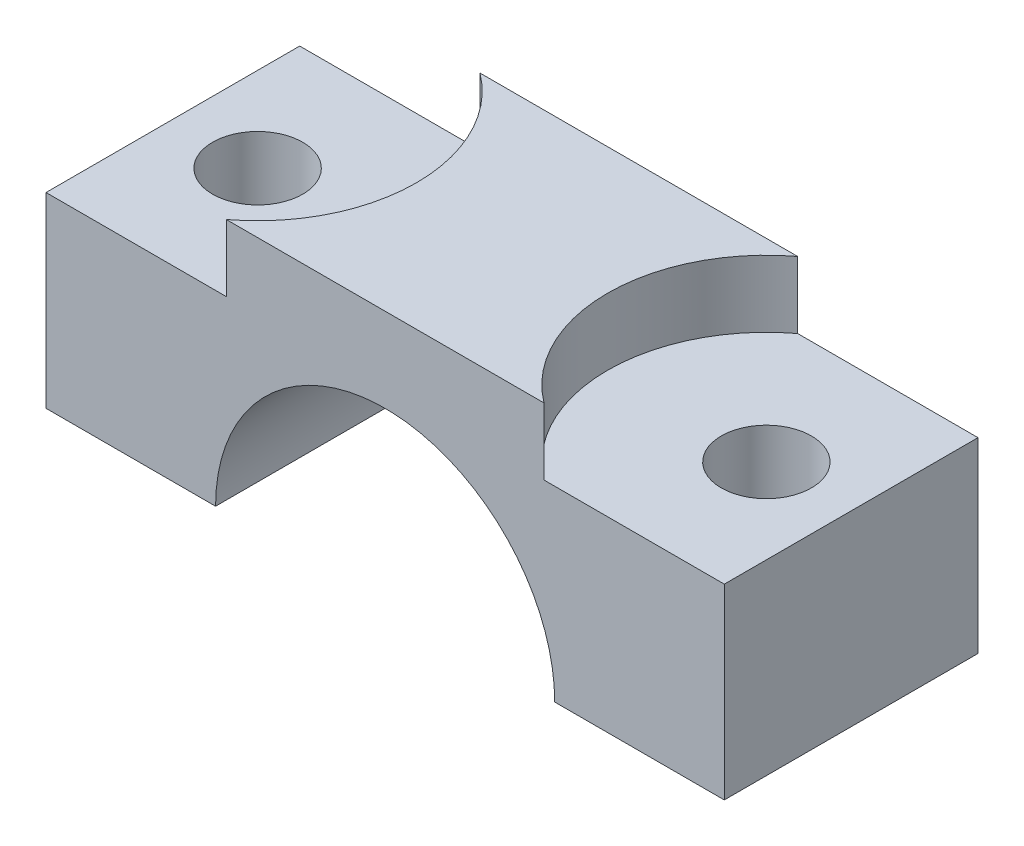
ISO-10303-21;
HEADER;
FILE_DESCRIPTION(('STEP AP214'),'2;1');
FILE_NAME('part.step','',(''),(''),'','','');
FILE_SCHEMA(('AUTOMOTIVE_DESIGN { 1 0 10303 214 1 1 1 1 }'));
ENDSEC;
DATA;
#1=APPLICATION_CONTEXT('core data for automotive mechanical design processes');
#2=APPLICATION_PROTOCOL_DEFINITION('international standard','automotive_design',2000,#1);
#3=PRODUCT_CONTEXT('',#1,'mechanical');
#4=PRODUCT('Part','Part','',(#3));
#5=PRODUCT_RELATED_PRODUCT_CATEGORY('part','',(#4));
#6=PRODUCT_DEFINITION_FORMATION('','',#4);
#7=PRODUCT_DEFINITION_CONTEXT('part definition',#1,'design');
#8=PRODUCT_DEFINITION('design','',#6,#7);
#9=PRODUCT_DEFINITION_SHAPE('','',#8);
#10=(LENGTH_UNIT() NAMED_UNIT(*) SI_UNIT(.MILLI.,.METRE.));
#11=(NAMED_UNIT(*) PLANE_ANGLE_UNIT() SI_UNIT($,.RADIAN.));
#12=(NAMED_UNIT(*) SI_UNIT($,.STERADIAN.) SOLID_ANGLE_UNIT());
#13=UNCERTAINTY_MEASURE_WITH_UNIT(LENGTH_MEASURE(1.E-05),#10,'distance_accuracy_value','');
#14=(GEOMETRIC_REPRESENTATION_CONTEXT(3) GLOBAL_UNCERTAINTY_ASSIGNED_CONTEXT((#13)) GLOBAL_UNIT_ASSIGNED_CONTEXT((#10,
#11,#12)) REPRESENTATION_CONTEXT('',''));
#15=CARTESIAN_POINT('',(0.,0.,0.));
#16=DIRECTION('',(0.,0.,1.));
#17=DIRECTION('',(1.,0.,0.));
#18=AXIS2_PLACEMENT_3D('',#15,#16,#17);
#19=CARTESIAN_POINT('',(25.4,0.,19.));
#20=DIRECTION('',(-1.,0.,0.));
#21=DIRECTION('',(0.,0.,1.));
#22=AXIS2_PLACEMENT_3D('',#19,#20,#21);
#23=PLANE('',#22);
#24=DIRECTION('',(0.,1.,0.));
#25=VECTOR('',#24,1.);
#26=CARTESIAN_POINT('',(25.4,0.,0.));
#27=LINE('',#26,#25);
#28=CARTESIAN_POINT('',(25.4,0.,0.));
#29=VERTEX_POINT('',#28);
#30=CARTESIAN_POINT('',(25.4,14.,0.));
#31=VERTEX_POINT('',#30);
#32=EDGE_CURVE('E142',#29,#31,#27,.T.);
#33=ORIENTED_EDGE('',*,*,#32,.T.);
#34=DIRECTION('',(0.,0.,1.));
#35=VECTOR('',#34,1.);
#36=CARTESIAN_POINT('',(25.4,14.,19.));
#37=LINE('',#36,#35);
#38=CARTESIAN_POINT('',(25.4,14.,19.));
#39=VERTEX_POINT('',#38);
#40=EDGE_CURVE('E124',#31,#39,#37,.T.);
#41=ORIENTED_EDGE('',*,*,#40,.T.);
#42=DIRECTION('',(0.,1.,0.));
#43=VECTOR('',#42,1.);
#44=CARTESIAN_POINT('',(25.4,0.,19.));
#45=LINE('',#44,#43);
#46=CARTESIAN_POINT('',(25.4,0.,19.));
#47=VERTEX_POINT('',#46);
#48=EDGE_CURVE('E161',#47,#39,#45,.T.);
#49=ORIENTED_EDGE('',*,*,#48,.F.);
#50=DIRECTION('',(0.,0.,-1.));
#51=VECTOR('',#50,1.);
#52=CARTESIAN_POINT('',(25.4,0.,19.));
#53=LINE('',#52,#51);
#54=EDGE_CURVE('E162',#47,#29,#53,.T.);
#55=ORIENTED_EDGE('',*,*,#54,.T.);
#56=EDGE_LOOP('',(#33,#41,#49,#55));
#57=FACE_BOUND('',#56,.T.);
#58=ADVANCED_FACE('F39',(#57),#23,.F.);
#59=CARTESIAN_POINT('',(25.4,19.,19.));
#60=DIRECTION('',(0.,-1.,0.));
#61=DIRECTION('',(0.,0.,-1.));
#62=AXIS2_PLACEMENT_3D('',#59,#60,#61);
#63=PLANE('',#62);
#64=DIRECTION('',(-1.,0.,0.));
#65=VECTOR('',#64,1.);
#66=CARTESIAN_POINT('',(25.4,19.,19.));
#67=LINE('',#66,#65);
#68=CARTESIAN_POINT('',(11.8958713842984,19.,19.));
#69=VERTEX_POINT('',#68);
#70=CARTESIAN_POINT('',(-11.8958713842984,19.,19.));
#71=VERTEX_POINT('',#70);
#72=EDGE_CURVE('E133',#69,#71,#67,.T.);
#73=ORIENTED_EDGE('',*,*,#72,.F.);
#74=CARTESIAN_POINT('',(19.05,19.,9.5));
#75=DIRECTION('',(0.,1.,0.));
#76=DIRECTION('',(0.,0.,1.));
#77=AXIS2_PLACEMENT_3D('',#74,#75,#76);
#78=CIRCLE('',#77,11.8925);
#79=CARTESIAN_POINT('',(11.8958713842984,19.,0.));
#80=VERTEX_POINT('',#79);
#81=EDGE_CURVE('E55',#80,#69,#78,.T.);
#82=ORIENTED_EDGE('',*,*,#81,.F.);
#83=DIRECTION('',(-1.,0.,0.));
#84=VECTOR('',#83,1.);
#85=CARTESIAN_POINT('',(25.4,19.,0.));
#86=LINE('',#85,#84);
#87=CARTESIAN_POINT('',(-11.8958713842984,19.,0.));
#88=VERTEX_POINT('',#87);
#89=EDGE_CURVE('E131',#80,#88,#86,.T.);
#90=ORIENTED_EDGE('',*,*,#89,.T.);
#91=CARTESIAN_POINT('',(-19.05,19.,9.5));
#92=DIRECTION('',(0.,1.,0.));
#93=DIRECTION('',(0.,0.,1.));
#94=AXIS2_PLACEMENT_3D('',#91,#92,#93);
#95=CIRCLE('',#94,11.8925);
#96=EDGE_CURVE('E239',#71,#88,#95,.T.);
#97=ORIENTED_EDGE('',*,*,#96,.F.);
#98=EDGE_LOOP('',(#73,#82,#90,#97));
#99=FACE_BOUND('',#98,.T.);
#100=ADVANCED_FACE('F129',(#99),#63,.F.);
#101=CARTESIAN_POINT('',(-25.4,19.,19.));
#102=DIRECTION('',(1.,0.,0.));
#103=DIRECTION('',(0.,0.,-1.));
#104=AXIS2_PLACEMENT_3D('',#101,#102,#103);
#105=PLANE('',#104);
#106=DIRECTION('',(0.,-1.,0.));
#107=VECTOR('',#106,1.);
#108=CARTESIAN_POINT('',(-25.4,19.,19.));
#109=LINE('',#108,#107);
#110=CARTESIAN_POINT('',(-25.4,14.,19.));
#111=VERTEX_POINT('',#110);
#112=CARTESIAN_POINT('',(-25.4,0.,19.));
#113=VERTEX_POINT('',#112);
#114=EDGE_CURVE('E210',#111,#113,#109,.T.);
#115=ORIENTED_EDGE('',*,*,#114,.F.);
#116=DIRECTION('',(0.,0.,-1.));
#117=VECTOR('',#116,1.);
#118=CARTESIAN_POINT('',(-25.4,14.,19.));
#119=LINE('',#118,#117);
#120=CARTESIAN_POINT('',(-25.4,14.,0.));
#121=VERTEX_POINT('',#120);
#122=EDGE_CURVE('E191',#111,#121,#119,.T.);
#123=ORIENTED_EDGE('',*,*,#122,.T.);
#124=DIRECTION('',(0.,-1.,0.));
#125=VECTOR('',#124,1.);
#126=CARTESIAN_POINT('',(-25.4,19.,0.));
#127=LINE('',#126,#125);
#128=CARTESIAN_POINT('',(-25.4,0.,0.));
#129=VERTEX_POINT('',#128);
#130=EDGE_CURVE('E141',#121,#129,#127,.T.);
#131=ORIENTED_EDGE('',*,*,#130,.T.);
#132=DIRECTION('',(0.,0.,-1.));
#133=VECTOR('',#132,1.);
#134=CARTESIAN_POINT('',(-25.4,0.,19.));
#135=LINE('',#134,#133);
#136=EDGE_CURVE('E175',#113,#129,#135,.T.);
#137=ORIENTED_EDGE('',*,*,#136,.F.);
#138=EDGE_LOOP('',(#115,#123,#131,#137));
#139=FACE_BOUND('',#138,.T.);
#140=ADVANCED_FACE('F255',(#139),#105,.F.);
#141=CARTESIAN_POINT('',(-25.4,0.,19.));
#142=DIRECTION('',(0.,1.,0.));
#143=DIRECTION('',(0.,0.,1.));
#144=AXIS2_PLACEMENT_3D('',#141,#142,#143);
#145=PLANE('',#144);
#146=CARTESIAN_POINT('',(-19.05,0.,9.5));
#147=DIRECTION('',(0.,1.,0.));
#148=DIRECTION('',(0.,0.,1.));
#149=AXIS2_PLACEMENT_3D('',#146,#147,#148);
#150=CIRCLE('',#149,3.375);
#151=CARTESIAN_POINT('',(-19.05,0.,12.875));
#152=VERTEX_POINT('',#151);
#153=EDGE_CURVE('E149',#152,#152,#150,.T.);
#154=ORIENTED_EDGE('',*,*,#153,.T.);
#155=EDGE_LOOP('',(#154));
#156=FACE_BOUND('',#155,.T.);
#157=DIRECTION('',(1.,0.,0.));
#158=VECTOR('',#157,1.);
#159=CARTESIAN_POINT('',(-25.4,0.,0.));
#160=LINE('',#159,#158);
#161=CARTESIAN_POINT('',(-12.7,0.,0.));
#162=VERTEX_POINT('',#161);
#163=EDGE_CURVE('E146',#129,#162,#160,.T.);
#164=ORIENTED_EDGE('',*,*,#163,.T.);
#165=DIRECTION('',(0.,0.,-1.));
#166=VECTOR('',#165,1.);
#167=CARTESIAN_POINT('',(-12.7,0.,19.));
#168=LINE('',#167,#166);
#169=CARTESIAN_POINT('',(-12.7,0.,19.));
#170=VERTEX_POINT('',#169);
#171=EDGE_CURVE('E171',#170,#162,#168,.T.);
#172=ORIENTED_EDGE('',*,*,#171,.F.);
#173=DIRECTION('',(1.,0.,0.));
#174=VECTOR('',#173,1.);
#175=CARTESIAN_POINT('',(-25.4,0.,19.));
#176=LINE('',#175,#174);
#177=EDGE_CURVE('E217',#113,#170,#176,.T.);
#178=ORIENTED_EDGE('',*,*,#177,.F.);
#179=ORIENTED_EDGE('',*,*,#136,.T.);
#180=EDGE_LOOP('',(#164,#172,#178,#179));
#181=FACE_BOUND('',#180,.T.);
#182=ADVANCED_FACE('F261',(#156,#181),#145,.F.);
#183=CARTESIAN_POINT('',(0.,0.,19.));
#184=DIRECTION('',(0.,0.,-1.));
#185=DIRECTION('',(-1.,0.,0.));
#186=AXIS2_PLACEMENT_3D('',#183,#184,#185);
#187=CYLINDRICAL_SURFACE('',#186,12.7);
#188=CARTESIAN_POINT('',(0.,0.,0.));
#189=DIRECTION('',(0.,0.,-1.));
#190=DIRECTION('',(1.,0.,0.));
#191=AXIS2_PLACEMENT_3D('',#188,#189,#190);
#192=CIRCLE('',#191,12.7);
#193=CARTESIAN_POINT('',(12.7,0.,0.));
#194=VERTEX_POINT('',#193);
#195=EDGE_CURVE('E155',#162,#194,#192,.T.);
#196=ORIENTED_EDGE('',*,*,#195,.T.);
#197=DIRECTION('',(0.,0.,-1.));
#198=VECTOR('',#197,1.);
#199=CARTESIAN_POINT('',(12.7,0.,19.));
#200=LINE('',#199,#198);
#201=CARTESIAN_POINT('',(12.7,0.,19.));
#202=VERTEX_POINT('',#201);
#203=EDGE_CURVE('E166',#202,#194,#200,.T.);
#204=ORIENTED_EDGE('',*,*,#203,.F.);
#205=CARTESIAN_POINT('',(0.,0.,19.));
#206=DIRECTION('',(0.,0.,-1.));
#207=DIRECTION('',(1.,0.,0.));
#208=AXIS2_PLACEMENT_3D('',#205,#206,#207);
#209=CIRCLE('',#208,12.7);
#210=EDGE_CURVE('E220',#170,#202,#209,.T.);
#211=ORIENTED_EDGE('',*,*,#210,.F.);
#212=ORIENTED_EDGE('',*,*,#171,.T.);
#213=EDGE_LOOP('',(#196,#204,#211,#212));
#214=FACE_BOUND('',#213,.T.);
#215=ADVANCED_FACE('F228',(#214),#187,.F.);
#216=CARTESIAN_POINT('',(12.7,0.,19.));
#217=DIRECTION('',(0.,1.,0.));
#218=DIRECTION('',(0.,0.,1.));
#219=AXIS2_PLACEMENT_3D('',#216,#217,#218);
#220=PLANE('',#219);
#221=CARTESIAN_POINT('',(19.05,0.,9.5));
#222=DIRECTION('',(0.,1.,0.));
#223=DIRECTION('',(0.,0.,1.));
#224=AXIS2_PLACEMENT_3D('',#221,#222,#223);
#225=CIRCLE('',#224,3.375);
#226=CARTESIAN_POINT('',(19.05,0.,12.875));
#227=VERTEX_POINT('',#226);
#228=EDGE_CURVE('E42',#227,#227,#225,.T.);
#229=ORIENTED_EDGE('',*,*,#228,.T.);
#230=EDGE_LOOP('',(#229));
#231=FACE_BOUND('',#230,.T.);
#232=DIRECTION('',(1.,0.,0.));
#233=VECTOR('',#232,1.);
#234=CARTESIAN_POINT('',(12.7,0.,0.));
#235=LINE('',#234,#233);
#236=EDGE_CURVE('E158',#194,#29,#235,.T.);
#237=ORIENTED_EDGE('',*,*,#236,.T.);
#238=ORIENTED_EDGE('',*,*,#54,.F.);
#239=DIRECTION('',(1.,0.,0.));
#240=VECTOR('',#239,1.);
#241=CARTESIAN_POINT('',(12.7,0.,19.));
#242=LINE('',#241,#240);
#243=EDGE_CURVE('E167',#202,#47,#242,.T.);
#244=ORIENTED_EDGE('',*,*,#243,.F.);
#245=ORIENTED_EDGE('',*,*,#203,.T.);
#246=EDGE_LOOP('',(#237,#238,#244,#245));
#247=FACE_BOUND('',#246,.T.);
#248=ADVANCED_FACE('F232',(#231,#247),#220,.F.);
#249=CARTESIAN_POINT('',(0.,0.,19.));
#250=DIRECTION('',(0.,0.,1.));
#251=DIRECTION('',(1.,0.,0.));
#252=AXIS2_PLACEMENT_3D('',#249,#250,#251);
#253=PLANE('',#252);
#254=DIRECTION('',(1.,0.,0.));
#255=VECTOR('',#254,1.);
#256=CARTESIAN_POINT('',(0.,14.,19.));
#257=LINE('',#256,#255);
#258=CARTESIAN_POINT('',(11.8958713842984,14.,19.));
#259=VERTEX_POINT('',#258);
#260=EDGE_CURVE('E11',#259,#39,#257,.T.);
#261=ORIENTED_EDGE('',*,*,#260,.F.);
#262=DIRECTION('',(0.,1.,0.));
#263=VECTOR('',#262,1.);
#264=CARTESIAN_POINT('',(11.8958713842984,19.,19.));
#265=LINE('',#264,#263);
#266=EDGE_CURVE('E48',#69,#259,#265,.F.);
#267=ORIENTED_EDGE('',*,*,#266,.F.);
#268=ORIENTED_EDGE('',*,*,#72,.T.);
#269=DIRECTION('',(0.,1.,0.));
#270=VECTOR('',#269,1.);
#271=CARTESIAN_POINT('',(-11.8958713842984,19.,19.));
#272=LINE('',#271,#270);
#273=CARTESIAN_POINT('',(-11.8958713842984,14.,19.));
#274=VERTEX_POINT('',#273);
#275=EDGE_CURVE('E179',#274,#71,#272,.T.);
#276=ORIENTED_EDGE('',*,*,#275,.F.);
#277=DIRECTION('',(1.,0.,0.));
#278=VECTOR('',#277,1.);
#279=CARTESIAN_POINT('',(0.,14.,19.));
#280=LINE('',#279,#278);
#281=EDGE_CURVE('E182',#111,#274,#280,.T.);
#282=ORIENTED_EDGE('',*,*,#281,.F.);
#283=ORIENTED_EDGE('',*,*,#114,.T.);
#284=ORIENTED_EDGE('',*,*,#177,.T.);
#285=ORIENTED_EDGE('',*,*,#210,.T.);
#286=ORIENTED_EDGE('',*,*,#243,.T.);
#287=ORIENTED_EDGE('',*,*,#48,.T.);
#288=EDGE_LOOP('',(#261,#267,#268,#276,#282,#283,#284,#285,#286,#287));
#289=FACE_BOUND('',#288,.T.);
#290=ADVANCED_FACE('F202',(#289),#253,.T.);
#291=CARTESIAN_POINT('',(0.,0.,0.));
#292=DIRECTION('',(0.,0.,1.));
#293=DIRECTION('',(1.,0.,0.));
#294=AXIS2_PLACEMENT_3D('',#291,#292,#293);
#295=PLANE('',#294);
#296=DIRECTION('',(0.,1.,0.));
#297=VECTOR('',#296,1.);
#298=CARTESIAN_POINT('',(11.8958713842984,19.,0.));
#299=LINE('',#298,#297);
#300=CARTESIAN_POINT('',(11.8958713842984,14.,0.));
#301=VERTEX_POINT('',#300);
#302=EDGE_CURVE('E116',#80,#301,#299,.F.);
#303=ORIENTED_EDGE('',*,*,#302,.T.);
#304=DIRECTION('',(1.,0.,0.));
#305=VECTOR('',#304,1.);
#306=CARTESIAN_POINT('',(0.,14.,0.));
#307=LINE('',#306,#305);
#308=EDGE_CURVE('E198',#301,#31,#307,.T.);
#309=ORIENTED_EDGE('',*,*,#308,.T.);
#310=ORIENTED_EDGE('',*,*,#32,.F.);
#311=ORIENTED_EDGE('',*,*,#236,.F.);
#312=ORIENTED_EDGE('',*,*,#195,.F.);
#313=ORIENTED_EDGE('',*,*,#163,.F.);
#314=ORIENTED_EDGE('',*,*,#130,.F.);
#315=DIRECTION('',(1.,0.,0.));
#316=VECTOR('',#315,1.);
#317=CARTESIAN_POINT('',(0.,14.,0.));
#318=LINE('',#317,#316);
#319=CARTESIAN_POINT('',(-11.8958713842984,14.,0.));
#320=VERTEX_POINT('',#319);
#321=EDGE_CURVE('E185',#121,#320,#318,.T.);
#322=ORIENTED_EDGE('',*,*,#321,.T.);
#323=DIRECTION('',(0.,1.,0.));
#324=VECTOR('',#323,1.);
#325=CARTESIAN_POINT('',(-11.8958713842984,19.,0.));
#326=LINE('',#325,#324);
#327=EDGE_CURVE('E139',#320,#88,#326,.T.);
#328=ORIENTED_EDGE('',*,*,#327,.T.);
#329=ORIENTED_EDGE('',*,*,#89,.F.);
#330=EDGE_LOOP('',(#303,#309,#310,#311,#312,#313,#314,#322,#328,#329));
#331=FACE_BOUND('',#330,.T.);
#332=ADVANCED_FACE('F137',(#331),#295,.F.);
#333=CARTESIAN_POINT('',(-19.05,19.,9.5));
#334=DIRECTION('',(0.,1.,0.));
#335=DIRECTION('',(0.,0.,1.));
#336=AXIS2_PLACEMENT_3D('',#333,#334,#335);
#337=CYLINDRICAL_SURFACE('',#336,3.375);
#338=CARTESIAN_POINT('',(-19.05,14.,9.5));
#339=DIRECTION('',(0.,1.,0.));
#340=DIRECTION('',(0.,0.,1.));
#341=AXIS2_PLACEMENT_3D('',#338,#339,#340);
#342=CIRCLE('',#341,3.37500000000001);
#343=CARTESIAN_POINT('',(-19.05,14.,12.875));
#344=VERTEX_POINT('',#343);
#345=EDGE_CURVE('E246',#344,#344,#342,.T.);
#346=ORIENTED_EDGE('',*,*,#345,.T.);
#347=EDGE_LOOP('',(#346));
#348=FACE_BOUND('',#347,.T.);
#349=ORIENTED_EDGE('',*,*,#153,.F.);
#350=EDGE_LOOP('',(#349));
#351=FACE_BOUND('',#350,.T.);
#352=ADVANCED_FACE('F312',(#348,#351),#337,.F.);
#353=CARTESIAN_POINT('',(-19.05,19.,9.5));
#354=DIRECTION('',(0.,1.,0.));
#355=DIRECTION('',(0.,0.,1.));
#356=AXIS2_PLACEMENT_3D('',#353,#354,#355);
#357=CYLINDRICAL_SURFACE('',#356,11.8925);
#358=CARTESIAN_POINT('',(-19.05,14.,9.5));
#359=DIRECTION('',(0.,1.,0.));
#360=DIRECTION('',(0.,0.,1.));
#361=AXIS2_PLACEMENT_3D('',#358,#359,#360);
#362=CIRCLE('',#361,11.8925);
#363=EDGE_CURVE('E63',#274,#320,#362,.T.);
#364=ORIENTED_EDGE('',*,*,#363,.F.);
#365=ORIENTED_EDGE('',*,*,#275,.T.);
#366=ORIENTED_EDGE('',*,*,#96,.T.);
#367=ORIENTED_EDGE('',*,*,#327,.F.);
#368=EDGE_LOOP('',(#364,#365,#366,#367));
#369=FACE_BOUND('',#368,.T.);
#370=ADVANCED_FACE('F321',(#369),#357,.F.);
#371=CARTESIAN_POINT('',(-15.675,14.,9.5));
#372=DIRECTION('',(0.,-1.,0.));
#373=DIRECTION('',(0.,0.,-1.));
#374=AXIS2_PLACEMENT_3D('',#371,#372,#373);
#375=PLANE('',#374);
#376=ORIENTED_EDGE('',*,*,#281,.T.);
#377=ORIENTED_EDGE('',*,*,#363,.T.);
#378=ORIENTED_EDGE('',*,*,#321,.F.);
#379=ORIENTED_EDGE('',*,*,#122,.F.);
#380=EDGE_LOOP('',(#376,#377,#378,#379));
#381=FACE_BOUND('',#380,.T.);
#382=ORIENTED_EDGE('',*,*,#345,.F.);
#383=EDGE_LOOP('',(#382));
#384=FACE_BOUND('',#383,.T.);
#385=ADVANCED_FACE('F331',(#381,#384),#375,.F.);
#386=CARTESIAN_POINT('',(19.05,19.,9.5));
#387=DIRECTION('',(0.,1.,0.));
#388=DIRECTION('',(0.,0.,1.));
#389=AXIS2_PLACEMENT_3D('',#386,#387,#388);
#390=CYLINDRICAL_SURFACE('',#389,3.375);
#391=CARTESIAN_POINT('',(19.05,14.,9.5));
#392=DIRECTION('',(0.,1.,0.));
#393=DIRECTION('',(0.,0.,1.));
#394=AXIS2_PLACEMENT_3D('',#391,#392,#393);
#395=CIRCLE('',#394,3.37500000000001);
#396=CARTESIAN_POINT('',(19.05,14.,12.875));
#397=VERTEX_POINT('',#396);
#398=EDGE_CURVE('E125',#397,#397,#395,.T.);
#399=ORIENTED_EDGE('',*,*,#398,.T.);
#400=EDGE_LOOP('',(#399));
#401=FACE_BOUND('',#400,.T.);
#402=ORIENTED_EDGE('',*,*,#228,.F.);
#403=EDGE_LOOP('',(#402));
#404=FACE_BOUND('',#403,.T.);
#405=ADVANCED_FACE('F340',(#401,#404),#390,.F.);
#406=CARTESIAN_POINT('',(22.425,14.,9.5));
#407=DIRECTION('',(0.,-1.,0.));
#408=DIRECTION('',(0.,0.,-1.));
#409=AXIS2_PLACEMENT_3D('',#406,#407,#408);
#410=PLANE('',#409);
#411=ORIENTED_EDGE('',*,*,#398,.F.);
#412=EDGE_LOOP('',(#411));
#413=FACE_BOUND('',#412,.T.);
#414=CARTESIAN_POINT('',(19.05,14.,9.5));
#415=DIRECTION('',(0.,1.,0.));
#416=DIRECTION('',(0.,0.,1.));
#417=AXIS2_PLACEMENT_3D('',#414,#415,#416);
#418=CIRCLE('',#417,11.8925);
#419=EDGE_CURVE('E119',#301,#259,#418,.T.);
#420=ORIENTED_EDGE('',*,*,#419,.T.);
#421=ORIENTED_EDGE('',*,*,#260,.T.);
#422=ORIENTED_EDGE('',*,*,#40,.F.);
#423=ORIENTED_EDGE('',*,*,#308,.F.);
#424=EDGE_LOOP('',(#420,#421,#422,#423));
#425=FACE_BOUND('',#424,.T.);
#426=ADVANCED_FACE('F196',(#413,#425),#410,.F.);
#427=CARTESIAN_POINT('',(19.05,19.,9.5));
#428=DIRECTION('',(0.,1.,0.));
#429=DIRECTION('',(0.,0.,1.));
#430=AXIS2_PLACEMENT_3D('',#427,#428,#429);
#431=CYLINDRICAL_SURFACE('',#430,11.8925);
#432=ORIENTED_EDGE('',*,*,#81,.T.);
#433=ORIENTED_EDGE('',*,*,#266,.T.);
#434=ORIENTED_EDGE('',*,*,#419,.F.);
#435=ORIENTED_EDGE('',*,*,#302,.F.);
#436=EDGE_LOOP('',(#432,#433,#434,#435));
#437=FACE_BOUND('',#436,.T.);
#438=ADVANCED_FACE('F117',(#437),#431,.F.);
#439=CLOSED_SHELL('',(#58,#100,#140,#182,#215,#248,#290,#332,#352,#370,#385,#405,#426,#438));
#440=MANIFOLD_SOLID_BREP('B2',#439);
#441=ADVANCED_BREP_SHAPE_REPRESENTATION('',(#18,#440),#14);
#442=SHAPE_DEFINITION_REPRESENTATION(#9,#441);
ENDSEC;
END-ISO-10303-21;
